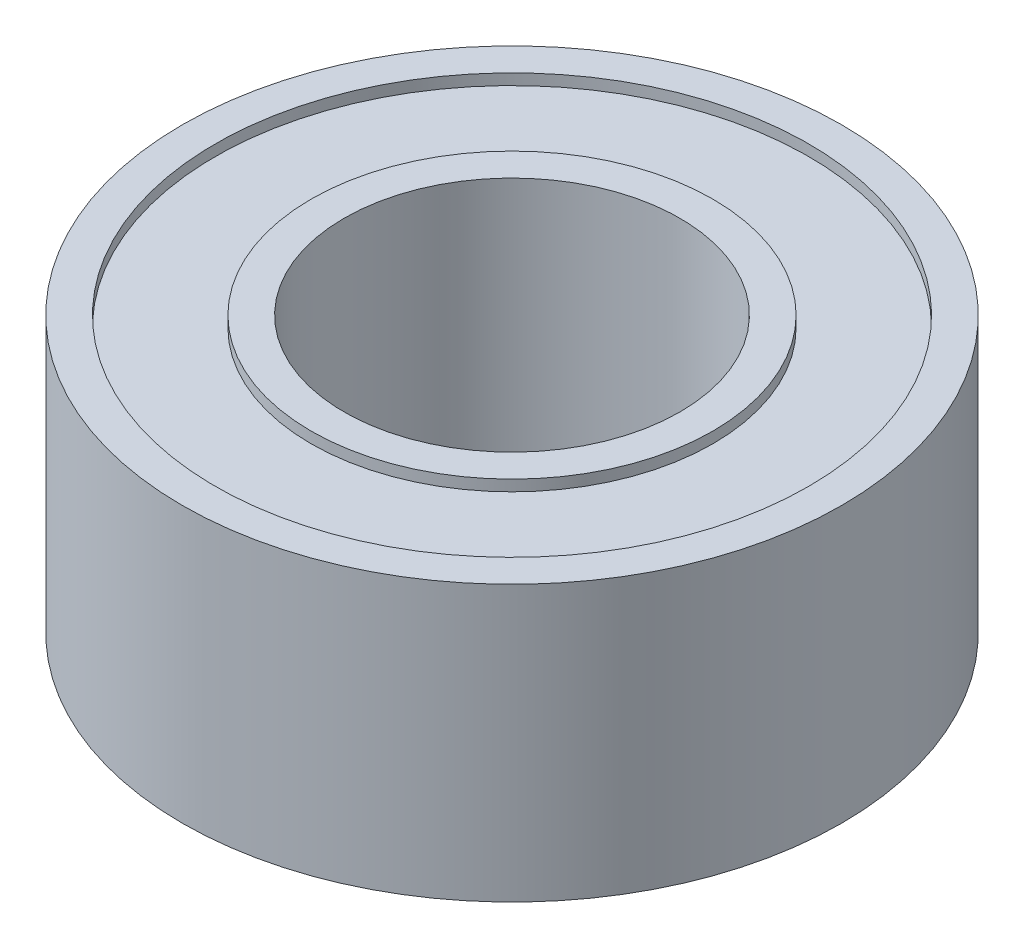
ISO-10303-21;
HEADER;
FILE_DESCRIPTION(('STEP AP214'),'2;1');
FILE_NAME('part.step','',(''),(''),'','','');
FILE_SCHEMA(('AUTOMOTIVE_DESIGN { 1 0 10303 214 1 1 1 1 }'));
ENDSEC;
DATA;
#1=APPLICATION_CONTEXT('core data for automotive mechanical design processes');
#2=APPLICATION_PROTOCOL_DEFINITION('international standard','automotive_design',2000,#1);
#3=PRODUCT_CONTEXT('',#1,'mechanical');
#4=PRODUCT('Part','Part','',(#3));
#5=PRODUCT_RELATED_PRODUCT_CATEGORY('part','',(#4));
#6=PRODUCT_DEFINITION_FORMATION('','',#4);
#7=PRODUCT_DEFINITION_CONTEXT('part definition',#1,'design');
#8=PRODUCT_DEFINITION('design','',#6,#7);
#9=PRODUCT_DEFINITION_SHAPE('','',#8);
#10=(LENGTH_UNIT() NAMED_UNIT(*) SI_UNIT(.MILLI.,.METRE.));
#11=(NAMED_UNIT(*) PLANE_ANGLE_UNIT() SI_UNIT($,.RADIAN.));
#12=(NAMED_UNIT(*) SI_UNIT($,.STERADIAN.) SOLID_ANGLE_UNIT());
#13=UNCERTAINTY_MEASURE_WITH_UNIT(LENGTH_MEASURE(1.E-05),#10,'distance_accuracy_value','');
#14=(GEOMETRIC_REPRESENTATION_CONTEXT(3) GLOBAL_UNCERTAINTY_ASSIGNED_CONTEXT((#13)) GLOBAL_UNIT_ASSIGNED_CONTEXT((#10,
#11,#12)) REPRESENTATION_CONTEXT('',''));
#15=CARTESIAN_POINT('',(0.,0.,0.));
#16=DIRECTION('',(0.,0.,1.));
#17=DIRECTION('',(1.,0.,0.));
#18=AXIS2_PLACEMENT_3D('',#15,#16,#17);
#19=CARTESIAN_POINT('',(-5.65,0.,32.315843454673));
#20=DIRECTION('',(0.,1.,0.));
#21=DIRECTION('',(1.,0.,0.));
#22=AXIS2_PLACEMENT_3D('',#19,#20,#21);
#23=PLANE('',#22);
#24=CARTESIAN_POINT('',(-5.65,0.,32.315843454673));
#25=DIRECTION('',(0.,1.,0.));
#26=DIRECTION('',(1.,0.,0.));
#27=AXIS2_PLACEMENT_3D('',#24,#25,#26);
#28=CIRCLE('',#27,1.525);
#29=CARTESIAN_POINT('',(-4.125,0.,32.315843454673));
#30=VERTEX_POINT('',#29);
#31=EDGE_CURVE('E10',#30,#30,#28,.T.);
#32=ORIENTED_EDGE('',*,*,#31,.F.);
#33=EDGE_LOOP('',(#32));
#34=FACE_BOUND('',#33,.T.);
#35=CARTESIAN_POINT('',(-5.65,0.,32.315843454673));
#36=DIRECTION('',(0.,1.,0.));
#37=DIRECTION('',(1.,0.,0.));
#38=AXIS2_PLACEMENT_3D('',#35,#36,#37);
#39=CIRCLE('',#38,1.825);
#40=CARTESIAN_POINT('',(-3.825,0.,32.315843454673));
#41=VERTEX_POINT('',#40);
#42=EDGE_CURVE('E69',#41,#41,#39,.T.);
#43=ORIENTED_EDGE('',*,*,#42,.T.);
#44=EDGE_LOOP('',(#43));
#45=FACE_BOUND('',#44,.T.);
#46=ADVANCED_FACE('F15',(#34,#45),#23,.T.);
#47=CARTESIAN_POINT('',(-5.65,-2.5,32.315843454673));
#48=DIRECTION('',(0.,1.,0.));
#49=DIRECTION('',(1.,0.,0.));
#50=AXIS2_PLACEMENT_3D('',#47,#48,#49);
#51=PLANE('',#50);
#52=CARTESIAN_POINT('',(-5.65,-2.5,32.315843454673));
#53=DIRECTION('',(0.,1.,0.));
#54=DIRECTION('',(1.,0.,0.));
#55=AXIS2_PLACEMENT_3D('',#52,#53,#54);
#56=CIRCLE('',#55,1.525);
#57=CARTESIAN_POINT('',(-4.125,-2.5,32.315843454673));
#58=VERTEX_POINT('',#57);
#59=EDGE_CURVE('E22',#58,#58,#56,.T.);
#60=ORIENTED_EDGE('',*,*,#59,.T.);
#61=EDGE_LOOP('',(#60));
#62=FACE_BOUND('',#61,.T.);
#63=CARTESIAN_POINT('',(-5.65,-2.5,32.315843454673));
#64=DIRECTION('',(0.,-1.,0.));
#65=DIRECTION('',(1.,0.,0.));
#66=AXIS2_PLACEMENT_3D('',#63,#64,#65);
#67=CIRCLE('',#66,1.825);
#68=CARTESIAN_POINT('',(-3.825,-2.5,32.315843454673));
#69=VERTEX_POINT('',#68);
#70=EDGE_CURVE('E49',#69,#69,#67,.T.);
#71=ORIENTED_EDGE('',*,*,#70,.T.);
#72=EDGE_LOOP('',(#71));
#73=FACE_BOUND('',#72,.T.);
#74=ADVANCED_FACE('F95',(#62,#73),#51,.F.);
#75=CARTESIAN_POINT('',(-5.65,0.,32.315843454673));
#76=DIRECTION('',(0.,-1.,0.));
#77=DIRECTION('',(1.,0.,0.));
#78=AXIS2_PLACEMENT_3D('',#75,#76,#77);
#79=CYLINDRICAL_SURFACE('',#78,2.995);
#80=CARTESIAN_POINT('',(-5.65,0.,32.315843454673));
#81=DIRECTION('',(0.,-1.,0.));
#82=DIRECTION('',(1.,0.,0.));
#83=AXIS2_PLACEMENT_3D('',#80,#81,#82);
#84=CIRCLE('',#83,2.995);
#85=CARTESIAN_POINT('',(-2.655,0.,32.315843454673));
#86=VERTEX_POINT('',#85);
#87=EDGE_CURVE('E53',#86,#86,#84,.T.);
#88=ORIENTED_EDGE('',*,*,#87,.T.);
#89=EDGE_LOOP('',(#88));
#90=FACE_BOUND('',#89,.T.);
#91=CARTESIAN_POINT('',(-5.65,-2.5,32.315843454673));
#92=DIRECTION('',(0.,-1.,0.));
#93=DIRECTION('',(1.,0.,0.));
#94=AXIS2_PLACEMENT_3D('',#91,#92,#93);
#95=CIRCLE('',#94,2.995);
#96=CARTESIAN_POINT('',(-2.655,-2.5,32.315843454673));
#97=VERTEX_POINT('',#96);
#98=EDGE_CURVE('E31',#97,#97,#95,.T.);
#99=ORIENTED_EDGE('',*,*,#98,.F.);
#100=EDGE_LOOP('',(#99));
#101=FACE_BOUND('',#100,.T.);
#102=ADVANCED_FACE('F100',(#90,#101),#79,.T.);
#103=CARTESIAN_POINT('',(-5.65,0.,32.315843454673));
#104=DIRECTION('',(0.,-1.,0.));
#105=DIRECTION('',(1.,0.,0.));
#106=AXIS2_PLACEMENT_3D('',#103,#104,#105);
#107=CYLINDRICAL_SURFACE('',#106,1.525);
#108=ORIENTED_EDGE('',*,*,#31,.T.);
#109=EDGE_LOOP('',(#108));
#110=FACE_BOUND('',#109,.T.);
#111=ORIENTED_EDGE('',*,*,#59,.F.);
#112=EDGE_LOOP('',(#111));
#113=FACE_BOUND('',#112,.T.);
#114=ADVANCED_FACE('F104',(#110,#113),#107,.F.);
#115=CARTESIAN_POINT('',(-5.65,-2.5,32.315843454673));
#116=DIRECTION('',(0.,1.,0.));
#117=DIRECTION('',(1.,0.,0.));
#118=AXIS2_PLACEMENT_3D('',#115,#116,#117);
#119=PLANE('',#118);
#120=CARTESIAN_POINT('',(-5.65,-2.5,32.315843454673));
#121=DIRECTION('',(0.,1.,0.));
#122=DIRECTION('',(1.,0.,0.));
#123=AXIS2_PLACEMENT_3D('',#120,#121,#122);
#124=CIRCLE('',#123,2.695);
#125=CARTESIAN_POINT('',(-2.955,-2.5,32.315843454673));
#126=VERTEX_POINT('',#125);
#127=EDGE_CURVE('E41',#126,#126,#124,.T.);
#128=ORIENTED_EDGE('',*,*,#127,.T.);
#129=EDGE_LOOP('',(#128));
#130=FACE_BOUND('',#129,.T.);
#131=ORIENTED_EDGE('',*,*,#98,.T.);
#132=EDGE_LOOP('',(#131));
#133=FACE_BOUND('',#132,.T.);
#134=ADVANCED_FACE('F126',(#130,#133),#119,.F.);
#135=CARTESIAN_POINT('',(-5.65,-2.4,32.315843454673));
#136=DIRECTION('',(0.,-1.,0.));
#137=DIRECTION('',(0.,0.,-1.));
#138=AXIS2_PLACEMENT_3D('',#135,#136,#137);
#139=PLANE('',#138);
#140=CARTESIAN_POINT('',(-5.65,-2.4,32.315843454673));
#141=DIRECTION('',(0.,-1.,0.));
#142=DIRECTION('',(1.,0.,0.));
#143=AXIS2_PLACEMENT_3D('',#140,#141,#142);
#144=CIRCLE('',#143,1.825);
#145=CARTESIAN_POINT('',(-3.825,-2.4,32.315843454673));
#146=VERTEX_POINT('',#145);
#147=EDGE_CURVE('E45',#146,#146,#144,.T.);
#148=ORIENTED_EDGE('',*,*,#147,.F.);
#149=EDGE_LOOP('',(#148));
#150=FACE_BOUND('',#149,.T.);
#151=CARTESIAN_POINT('',(-5.65,-2.4,32.315843454673));
#152=DIRECTION('',(0.,1.,0.));
#153=DIRECTION('',(1.,0.,0.));
#154=AXIS2_PLACEMENT_3D('',#151,#152,#153);
#155=CIRCLE('',#154,2.695);
#156=CARTESIAN_POINT('',(-2.955,-2.4,32.315843454673));
#157=VERTEX_POINT('',#156);
#158=EDGE_CURVE('E39',#157,#157,#155,.T.);
#159=ORIENTED_EDGE('',*,*,#158,.F.);
#160=EDGE_LOOP('',(#159));
#161=FACE_BOUND('',#160,.T.);
#162=ADVANCED_FACE('F122',(#150,#161),#139,.T.);
#163=CARTESIAN_POINT('',(-5.65,-2.5,32.315843454673));
#164=DIRECTION('',(0.,1.,0.));
#165=DIRECTION('',(1.,0.,0.));
#166=AXIS2_PLACEMENT_3D('',#163,#164,#165);
#167=CYLINDRICAL_SURFACE('',#166,2.695);
#168=ORIENTED_EDGE('',*,*,#158,.T.);
#169=EDGE_LOOP('',(#168));
#170=FACE_BOUND('',#169,.T.);
#171=ORIENTED_EDGE('',*,*,#127,.F.);
#172=EDGE_LOOP('',(#171));
#173=FACE_BOUND('',#172,.T.);
#174=ADVANCED_FACE('F118',(#170,#173),#167,.F.);
#175=CARTESIAN_POINT('',(-5.65,-2.5,32.315843454673));
#176=DIRECTION('',(0.,1.,0.));
#177=DIRECTION('',(1.,0.,0.));
#178=AXIS2_PLACEMENT_3D('',#175,#176,#177);
#179=CYLINDRICAL_SURFACE('',#178,1.825);
#180=ORIENTED_EDGE('',*,*,#147,.T.);
#181=EDGE_LOOP('',(#180));
#182=FACE_BOUND('',#181,.T.);
#183=ORIENTED_EDGE('',*,*,#70,.F.);
#184=EDGE_LOOP('',(#183));
#185=FACE_BOUND('',#184,.T.);
#186=ADVANCED_FACE('F114',(#182,#185),#179,.T.);
#187=CARTESIAN_POINT('',(-5.65,0.,32.315843454673));
#188=DIRECTION('',(0.,1.,0.));
#189=DIRECTION('',(1.,0.,0.));
#190=AXIS2_PLACEMENT_3D('',#187,#188,#189);
#191=PLANE('',#190);
#192=CARTESIAN_POINT('',(-5.65,0.,32.315843454673));
#193=DIRECTION('',(0.,-1.,0.));
#194=DIRECTION('',(1.,0.,0.));
#195=AXIS2_PLACEMENT_3D('',#192,#193,#194);
#196=CIRCLE('',#195,2.695);
#197=CARTESIAN_POINT('',(-2.955,0.,32.315843454673));
#198=VERTEX_POINT('',#197);
#199=EDGE_CURVE('E58',#198,#198,#196,.T.);
#200=ORIENTED_EDGE('',*,*,#199,.T.);
#201=EDGE_LOOP('',(#200));
#202=FACE_BOUND('',#201,.T.);
#203=ORIENTED_EDGE('',*,*,#87,.F.);
#204=EDGE_LOOP('',(#203));
#205=FACE_BOUND('',#204,.T.);
#206=ADVANCED_FACE('F110',(#202,#205),#191,.T.);
#207=CARTESIAN_POINT('',(-5.65,-0.1,32.315843454673));
#208=DIRECTION('',(0.,1.,0.));
#209=DIRECTION('',(1.,0.,0.));
#210=AXIS2_PLACEMENT_3D('',#207,#208,#209);
#211=PLANE('',#210);
#212=CARTESIAN_POINT('',(-5.65,-0.1,32.315843454673));
#213=DIRECTION('',(0.,1.,0.));
#214=DIRECTION('',(1.,0.,0.));
#215=AXIS2_PLACEMENT_3D('',#212,#213,#214);
#216=CIRCLE('',#215,1.825);
#217=CARTESIAN_POINT('',(-3.825,-0.1,32.315843454673));
#218=VERTEX_POINT('',#217);
#219=EDGE_CURVE('E65',#218,#218,#216,.T.);
#220=ORIENTED_EDGE('',*,*,#219,.F.);
#221=EDGE_LOOP('',(#220));
#222=FACE_BOUND('',#221,.T.);
#223=CARTESIAN_POINT('',(-5.65,-0.1,32.315843454673));
#224=DIRECTION('',(0.,-1.,0.));
#225=DIRECTION('',(1.,0.,0.));
#226=AXIS2_PLACEMENT_3D('',#223,#224,#225);
#227=CIRCLE('',#226,2.695);
#228=CARTESIAN_POINT('',(-2.955,-0.1,32.315843454673));
#229=VERTEX_POINT('',#228);
#230=EDGE_CURVE('E54',#229,#229,#227,.T.);
#231=ORIENTED_EDGE('',*,*,#230,.F.);
#232=EDGE_LOOP('',(#231));
#233=FACE_BOUND('',#232,.T.);
#234=ADVANCED_FACE('F89',(#222,#233),#211,.T.);
#235=CARTESIAN_POINT('',(-5.65,0.,32.315843454673));
#236=DIRECTION('',(0.,-1.,0.));
#237=DIRECTION('',(1.,0.,0.));
#238=AXIS2_PLACEMENT_3D('',#235,#236,#237);
#239=CYLINDRICAL_SURFACE('',#238,2.695);
#240=ORIENTED_EDGE('',*,*,#230,.T.);
#241=EDGE_LOOP('',(#240));
#242=FACE_BOUND('',#241,.T.);
#243=ORIENTED_EDGE('',*,*,#199,.F.);
#244=EDGE_LOOP('',(#243));
#245=FACE_BOUND('',#244,.T.);
#246=ADVANCED_FACE('F82',(#242,#245),#239,.F.);
#247=CARTESIAN_POINT('',(-5.65,0.,32.315843454673));
#248=DIRECTION('',(0.,-1.,0.));
#249=DIRECTION('',(1.,0.,0.));
#250=AXIS2_PLACEMENT_3D('',#247,#248,#249);
#251=CYLINDRICAL_SURFACE('',#250,1.825);
#252=ORIENTED_EDGE('',*,*,#219,.T.);
#253=EDGE_LOOP('',(#252));
#254=FACE_BOUND('',#253,.T.);
#255=ORIENTED_EDGE('',*,*,#42,.F.);
#256=EDGE_LOOP('',(#255));
#257=FACE_BOUND('',#256,.T.);
#258=ADVANCED_FACE('F80',(#254,#257),#251,.T.);
#259=CLOSED_SHELL('',(#46,#74,#102,#114,#134,#162,#174,#186,#206,#234,#246,#258));
#260=MANIFOLD_SOLID_BREP('B1',#259);
#261=ADVANCED_BREP_SHAPE_REPRESENTATION('',(#18,#260),#14);
#262=SHAPE_DEFINITION_REPRESENTATION(#9,#261);
ENDSEC;
END-ISO-10303-21;
